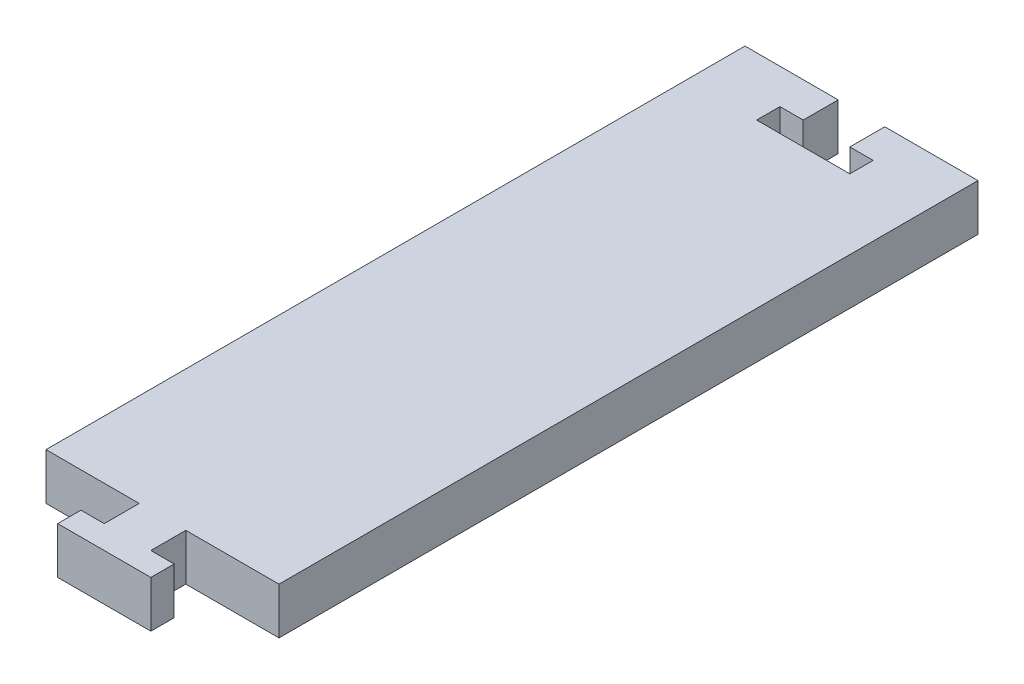
ISO-10303-21;
HEADER;
FILE_DESCRIPTION(('STEP AP214'),'2;1');
FILE_NAME('part.step','',(''),(''),'','','');
FILE_SCHEMA(('AUTOMOTIVE_DESIGN { 1 0 10303 214 1 1 1 1 }'));
ENDSEC;
DATA;
#1=APPLICATION_CONTEXT('core data for automotive mechanical design processes');
#2=APPLICATION_PROTOCOL_DEFINITION('international standard','automotive_design',2000,#1);
#3=PRODUCT_CONTEXT('',#1,'mechanical');
#4=PRODUCT('Part','Part','',(#3));
#5=PRODUCT_RELATED_PRODUCT_CATEGORY('part','',(#4));
#6=PRODUCT_DEFINITION_FORMATION('','',#4);
#7=PRODUCT_DEFINITION_CONTEXT('part definition',#1,'design');
#8=PRODUCT_DEFINITION('design','',#6,#7);
#9=PRODUCT_DEFINITION_SHAPE('','',#8);
#10=(LENGTH_UNIT() NAMED_UNIT(*) SI_UNIT(.MILLI.,.METRE.));
#11=(NAMED_UNIT(*) PLANE_ANGLE_UNIT() SI_UNIT($,.RADIAN.));
#12=(NAMED_UNIT(*) SI_UNIT($,.STERADIAN.) SOLID_ANGLE_UNIT());
#13=UNCERTAINTY_MEASURE_WITH_UNIT(LENGTH_MEASURE(1.E-05),#10,'distance_accuracy_value','');
#14=(GEOMETRIC_REPRESENTATION_CONTEXT(3) GLOBAL_UNCERTAINTY_ASSIGNED_CONTEXT((#13)) GLOBAL_UNIT_ASSIGNED_CONTEXT((#10,
#11,#12)) REPRESENTATION_CONTEXT('',''));
#15=CARTESIAN_POINT('',(0.,0.,0.));
#16=DIRECTION('',(0.,0.,1.));
#17=DIRECTION('',(1.,0.,0.));
#18=AXIS2_PLACEMENT_3D('',#15,#16,#17);
#19=CARTESIAN_POINT('',(10.,4.,17.5));
#20=DIRECTION('',(-1.,0.,0.));
#21=DIRECTION('',(0.,0.,1.));
#22=AXIS2_PLACEMENT_3D('',#19,#20,#21);
#23=PLANE('',#22);
#24=DIRECTION('',(0.,0.,-1.));
#25=VECTOR('',#24,1.);
#26=CARTESIAN_POINT('',(10.,0.,17.5));
#27=LINE('',#26,#25);
#28=CARTESIAN_POINT('',(10.,0.,17.5));
#29=VERTEX_POINT('',#28);
#30=CARTESIAN_POINT('',(9.99999999999999,0.,-42.5));
#31=VERTEX_POINT('',#30);
#32=EDGE_CURVE('E203',#29,#31,#27,.T.);
#33=ORIENTED_EDGE('',*,*,#32,.T.);
#34=DIRECTION('',(0.,-1.,0.));
#35=VECTOR('',#34,1.);
#36=CARTESIAN_POINT('',(9.99999999999999,4.,-42.5));
#37=LINE('',#36,#35);
#38=CARTESIAN_POINT('',(9.99999999999999,4.,-42.5));
#39=VERTEX_POINT('',#38);
#40=EDGE_CURVE('E11',#39,#31,#37,.T.);
#41=ORIENTED_EDGE('',*,*,#40,.F.);
#42=DIRECTION('',(0.,0.,-1.));
#43=VECTOR('',#42,1.);
#44=CARTESIAN_POINT('',(10.,4.,17.5));
#45=LINE('',#44,#43);
#46=CARTESIAN_POINT('',(10.,4.,17.5));
#47=VERTEX_POINT('',#46);
#48=EDGE_CURVE('E241',#47,#39,#45,.T.);
#49=ORIENTED_EDGE('',*,*,#48,.F.);
#50=DIRECTION('',(0.,-1.,0.));
#51=VECTOR('',#50,1.);
#52=CARTESIAN_POINT('',(10.,4.,17.5));
#53=LINE('',#52,#51);
#54=EDGE_CURVE('E199',#47,#29,#53,.T.);
#55=ORIENTED_EDGE('',*,*,#54,.T.);
#56=EDGE_LOOP('',(#33,#41,#49,#55));
#57=FACE_BOUND('',#56,.T.);
#58=ADVANCED_FACE('F35',(#57),#23,.F.);
#59=CARTESIAN_POINT('',(9.99999999999999,4.,-42.5));
#60=DIRECTION('',(0.,0.,1.));
#61=DIRECTION('',(1.,0.,0.));
#62=AXIS2_PLACEMENT_3D('',#59,#60,#61);
#63=PLANE('',#62);
#64=DIRECTION('',(-1.,0.,0.));
#65=VECTOR('',#64,1.);
#66=CARTESIAN_POINT('',(9.99999999999999,0.,-42.5));
#67=LINE('',#66,#65);
#68=CARTESIAN_POINT('',(2.,0.,-42.5));
#69=VERTEX_POINT('',#68);
#70=EDGE_CURVE('E206',#31,#69,#67,.T.);
#71=ORIENTED_EDGE('',*,*,#70,.T.);
#72=DIRECTION('',(0.,-1.,0.));
#73=VECTOR('',#72,1.);
#74=CARTESIAN_POINT('',(2.,4.,-42.5));
#75=LINE('',#74,#73);
#76=CARTESIAN_POINT('',(2.,4.,-42.5));
#77=VERTEX_POINT('',#76);
#78=EDGE_CURVE('E43',#77,#69,#75,.T.);
#79=ORIENTED_EDGE('',*,*,#78,.F.);
#80=DIRECTION('',(-1.,0.,0.));
#81=VECTOR('',#80,1.);
#82=CARTESIAN_POINT('',(9.99999999999999,4.,-42.5));
#83=LINE('',#82,#81);
#84=EDGE_CURVE('E130',#39,#77,#83,.T.);
#85=ORIENTED_EDGE('',*,*,#84,.F.);
#86=ORIENTED_EDGE('',*,*,#40,.T.);
#87=EDGE_LOOP('',(#71,#79,#85,#86));
#88=FACE_BOUND('',#87,.T.);
#89=ADVANCED_FACE('F359',(#88),#63,.F.);
#90=CARTESIAN_POINT('',(2.,4.,-39.5));
#91=DIRECTION('',(1.,0.,0.));
#92=DIRECTION('',(0.,0.,-1.));
#93=AXIS2_PLACEMENT_3D('',#90,#91,#92);
#94=PLANE('',#93);
#95=DIRECTION('',(0.,0.,1.));
#96=VECTOR('',#95,1.);
#97=CARTESIAN_POINT('',(2.,0.,-39.5));
#98=LINE('',#97,#96);
#99=CARTESIAN_POINT('',(2.,0.,-39.5));
#100=VERTEX_POINT('',#99);
#101=EDGE_CURVE('E208',#69,#100,#98,.T.);
#102=ORIENTED_EDGE('',*,*,#101,.T.);
#103=DIRECTION('',(0.,-1.,0.));
#104=VECTOR('',#103,1.);
#105=CARTESIAN_POINT('',(2.,4.,-39.5));
#106=LINE('',#105,#104);
#107=CARTESIAN_POINT('',(2.,4.,-39.5));
#108=VERTEX_POINT('',#107);
#109=EDGE_CURVE('E284',#108,#100,#106,.T.);
#110=ORIENTED_EDGE('',*,*,#109,.F.);
#111=DIRECTION('',(0.,0.,1.));
#112=VECTOR('',#111,1.);
#113=CARTESIAN_POINT('',(2.,4.,-39.5));
#114=LINE('',#113,#112);
#115=EDGE_CURVE('E292',#77,#108,#114,.T.);
#116=ORIENTED_EDGE('',*,*,#115,.F.);
#117=ORIENTED_EDGE('',*,*,#78,.T.);
#118=EDGE_LOOP('',(#102,#110,#116,#117));
#119=FACE_BOUND('',#118,.T.);
#120=ADVANCED_FACE('F290',(#119),#94,.F.);
#121=CARTESIAN_POINT('',(4.,4.,-39.5));
#122=DIRECTION('',(0.,0.,-1.));
#123=DIRECTION('',(-1.,0.,0.));
#124=AXIS2_PLACEMENT_3D('',#121,#122,#123);
#125=PLANE('',#124);
#126=DIRECTION('',(1.,0.,0.));
#127=VECTOR('',#126,1.);
#128=CARTESIAN_POINT('',(4.,0.,-39.5));
#129=LINE('',#128,#127);
#130=CARTESIAN_POINT('',(4.,0.,-39.5));
#131=VERTEX_POINT('',#130);
#132=EDGE_CURVE('E210',#100,#131,#129,.T.);
#133=ORIENTED_EDGE('',*,*,#132,.T.);
#134=DIRECTION('',(0.,-1.,0.));
#135=VECTOR('',#134,1.);
#136=CARTESIAN_POINT('',(4.,4.,-39.5));
#137=LINE('',#136,#135);
#138=CARTESIAN_POINT('',(4.,4.,-39.5));
#139=VERTEX_POINT('',#138);
#140=EDGE_CURVE('E281',#139,#131,#137,.T.);
#141=ORIENTED_EDGE('',*,*,#140,.F.);
#142=DIRECTION('',(1.,0.,0.));
#143=VECTOR('',#142,1.);
#144=CARTESIAN_POINT('',(4.,4.,-39.5));
#145=LINE('',#144,#143);
#146=EDGE_CURVE('E310',#108,#139,#145,.T.);
#147=ORIENTED_EDGE('',*,*,#146,.F.);
#148=ORIENTED_EDGE('',*,*,#109,.T.);
#149=EDGE_LOOP('',(#133,#141,#147,#148));
#150=FACE_BOUND('',#149,.T.);
#151=ADVANCED_FACE('F301',(#150),#125,.F.);
#152=CARTESIAN_POINT('',(4.,4.,-37.5));
#153=DIRECTION('',(1.,0.,0.));
#154=DIRECTION('',(0.,0.,-1.));
#155=AXIS2_PLACEMENT_3D('',#152,#153,#154);
#156=PLANE('',#155);
#157=DIRECTION('',(0.,0.,1.));
#158=VECTOR('',#157,1.);
#159=CARTESIAN_POINT('',(4.,0.,-37.5));
#160=LINE('',#159,#158);
#161=CARTESIAN_POINT('',(4.,0.,-37.5));
#162=VERTEX_POINT('',#161);
#163=EDGE_CURVE('E212',#131,#162,#160,.T.);
#164=ORIENTED_EDGE('',*,*,#163,.T.);
#165=DIRECTION('',(0.,-1.,0.));
#166=VECTOR('',#165,1.);
#167=CARTESIAN_POINT('',(4.,4.,-37.5));
#168=LINE('',#167,#166);
#169=CARTESIAN_POINT('',(4.,4.,-37.5));
#170=VERTEX_POINT('',#169);
#171=EDGE_CURVE('E278',#170,#162,#168,.T.);
#172=ORIENTED_EDGE('',*,*,#171,.F.);
#173=DIRECTION('',(0.,0.,1.));
#174=VECTOR('',#173,1.);
#175=CARTESIAN_POINT('',(4.,4.,-37.5));
#176=LINE('',#175,#174);
#177=EDGE_CURVE('E307',#139,#170,#176,.T.);
#178=ORIENTED_EDGE('',*,*,#177,.F.);
#179=ORIENTED_EDGE('',*,*,#140,.T.);
#180=EDGE_LOOP('',(#164,#172,#178,#179));
#181=FACE_BOUND('',#180,.T.);
#182=ADVANCED_FACE('F305',(#181),#156,.F.);
#183=CARTESIAN_POINT('',(-4.,4.,-37.5));
#184=DIRECTION('',(0.,0.,1.));
#185=DIRECTION('',(1.,0.,0.));
#186=AXIS2_PLACEMENT_3D('',#183,#184,#185);
#187=PLANE('',#186);
#188=DIRECTION('',(-1.,0.,0.));
#189=VECTOR('',#188,1.);
#190=CARTESIAN_POINT('',(-4.,0.,-37.5));
#191=LINE('',#190,#189);
#192=CARTESIAN_POINT('',(-4.,0.,-37.5));
#193=VERTEX_POINT('',#192);
#194=EDGE_CURVE('E214',#162,#193,#191,.T.);
#195=ORIENTED_EDGE('',*,*,#194,.T.);
#196=DIRECTION('',(0.,-1.,0.));
#197=VECTOR('',#196,1.);
#198=CARTESIAN_POINT('',(-4.,4.,-37.5));
#199=LINE('',#198,#197);
#200=CARTESIAN_POINT('',(-4.,4.,-37.5));
#201=VERTEX_POINT('',#200);
#202=EDGE_CURVE('E275',#201,#193,#199,.T.);
#203=ORIENTED_EDGE('',*,*,#202,.F.);
#204=DIRECTION('',(-1.,0.,0.));
#205=VECTOR('',#204,1.);
#206=CARTESIAN_POINT('',(-4.,4.,-37.5));
#207=LINE('',#206,#205);
#208=EDGE_CURVE('E309',#170,#201,#207,.T.);
#209=ORIENTED_EDGE('',*,*,#208,.F.);
#210=ORIENTED_EDGE('',*,*,#171,.T.);
#211=EDGE_LOOP('',(#195,#203,#209,#210));
#212=FACE_BOUND('',#211,.T.);
#213=ADVANCED_FACE('F372',(#212),#187,.F.);
#214=CARTESIAN_POINT('',(-4.,4.,-37.5));
#215=DIRECTION('',(-1.,0.,0.));
#216=DIRECTION('',(0.,0.,1.));
#217=AXIS2_PLACEMENT_3D('',#214,#215,#216);
#218=PLANE('',#217);
#219=DIRECTION('',(0.,0.,-1.));
#220=VECTOR('',#219,1.);
#221=CARTESIAN_POINT('',(-4.,0.,-37.5));
#222=LINE('',#221,#220);
#223=CARTESIAN_POINT('',(-4.,0.,-39.5));
#224=VERTEX_POINT('',#223);
#225=EDGE_CURVE('E216',#193,#224,#222,.T.);
#226=ORIENTED_EDGE('',*,*,#225,.T.);
#227=DIRECTION('',(0.,-1.,0.));
#228=VECTOR('',#227,1.);
#229=CARTESIAN_POINT('',(-4.,4.,-39.5));
#230=LINE('',#229,#228);
#231=CARTESIAN_POINT('',(-4.,4.,-39.5));
#232=VERTEX_POINT('',#231);
#233=EDGE_CURVE('E272',#232,#224,#230,.T.);
#234=ORIENTED_EDGE('',*,*,#233,.F.);
#235=DIRECTION('',(0.,0.,-1.));
#236=VECTOR('',#235,1.);
#237=CARTESIAN_POINT('',(-4.,4.,-37.5));
#238=LINE('',#237,#236);
#239=EDGE_CURVE('E312',#201,#232,#238,.T.);
#240=ORIENTED_EDGE('',*,*,#239,.F.);
#241=ORIENTED_EDGE('',*,*,#202,.T.);
#242=EDGE_LOOP('',(#226,#234,#240,#241));
#243=FACE_BOUND('',#242,.T.);
#244=ADVANCED_FACE('F375',(#243),#218,.F.);
#245=CARTESIAN_POINT('',(-4.,4.,-39.5));
#246=DIRECTION('',(0.,0.,-1.));
#247=DIRECTION('',(-1.,0.,0.));
#248=AXIS2_PLACEMENT_3D('',#245,#246,#247);
#249=PLANE('',#248);
#250=DIRECTION('',(1.,0.,0.));
#251=VECTOR('',#250,1.);
#252=CARTESIAN_POINT('',(-4.,0.,-39.5));
#253=LINE('',#252,#251);
#254=CARTESIAN_POINT('',(-2.,0.,-39.5));
#255=VERTEX_POINT('',#254);
#256=EDGE_CURVE('E218',#224,#255,#253,.T.);
#257=ORIENTED_EDGE('',*,*,#256,.T.);
#258=DIRECTION('',(0.,-1.,0.));
#259=VECTOR('',#258,1.);
#260=CARTESIAN_POINT('',(-2.,4.,-39.5));
#261=LINE('',#260,#259);
#262=CARTESIAN_POINT('',(-2.,4.,-39.5));
#263=VERTEX_POINT('',#262);
#264=EDGE_CURVE('E269',#263,#255,#261,.T.);
#265=ORIENTED_EDGE('',*,*,#264,.F.);
#266=DIRECTION('',(1.,0.,0.));
#267=VECTOR('',#266,1.);
#268=CARTESIAN_POINT('',(-4.,4.,-39.5));
#269=LINE('',#268,#267);
#270=EDGE_CURVE('E318',#232,#263,#269,.T.);
#271=ORIENTED_EDGE('',*,*,#270,.F.);
#272=ORIENTED_EDGE('',*,*,#233,.T.);
#273=EDGE_LOOP('',(#257,#265,#271,#272));
#274=FACE_BOUND('',#273,.T.);
#275=ADVANCED_FACE('F379',(#274),#249,.F.);
#276=CARTESIAN_POINT('',(-2.,4.,-39.5));
#277=DIRECTION('',(-1.,0.,0.));
#278=DIRECTION('',(0.,0.,1.));
#279=AXIS2_PLACEMENT_3D('',#276,#277,#278);
#280=PLANE('',#279);
#281=DIRECTION('',(0.,0.,-1.));
#282=VECTOR('',#281,1.);
#283=CARTESIAN_POINT('',(-2.,0.,-39.5));
#284=LINE('',#283,#282);
#285=CARTESIAN_POINT('',(-2.,0.,-42.5));
#286=VERTEX_POINT('',#285);
#287=EDGE_CURVE('E220',#255,#286,#284,.T.);
#288=ORIENTED_EDGE('',*,*,#287,.T.);
#289=DIRECTION('',(0.,-1.,0.));
#290=VECTOR('',#289,1.);
#291=CARTESIAN_POINT('',(-2.,4.,-42.5));
#292=LINE('',#291,#290);
#293=CARTESIAN_POINT('',(-2.,4.,-42.5));
#294=VERTEX_POINT('',#293);
#295=EDGE_CURVE('E266',#294,#286,#292,.T.);
#296=ORIENTED_EDGE('',*,*,#295,.F.);
#297=DIRECTION('',(0.,0.,-1.));
#298=VECTOR('',#297,1.);
#299=CARTESIAN_POINT('',(-2.,4.,-39.5));
#300=LINE('',#299,#298);
#301=EDGE_CURVE('E320',#263,#294,#300,.T.);
#302=ORIENTED_EDGE('',*,*,#301,.F.);
#303=ORIENTED_EDGE('',*,*,#264,.T.);
#304=EDGE_LOOP('',(#288,#296,#302,#303));
#305=FACE_BOUND('',#304,.T.);
#306=ADVANCED_FACE('F383',(#305),#280,.F.);
#307=CARTESIAN_POINT('',(-2.,4.,-42.5));
#308=DIRECTION('',(0.,0.,1.));
#309=DIRECTION('',(1.,0.,0.));
#310=AXIS2_PLACEMENT_3D('',#307,#308,#309);
#311=PLANE('',#310);
#312=DIRECTION('',(-1.,0.,0.));
#313=VECTOR('',#312,1.);
#314=CARTESIAN_POINT('',(-2.,0.,-42.5));
#315=LINE('',#314,#313);
#316=CARTESIAN_POINT('',(-10.,0.,-42.5));
#317=VERTEX_POINT('',#316);
#318=EDGE_CURVE('E222',#286,#317,#315,.T.);
#319=ORIENTED_EDGE('',*,*,#318,.T.);
#320=DIRECTION('',(0.,-1.,0.));
#321=VECTOR('',#320,1.);
#322=CARTESIAN_POINT('',(-10.,4.,-42.5));
#323=LINE('',#322,#321);
#324=CARTESIAN_POINT('',(-10.,4.,-42.5));
#325=VERTEX_POINT('',#324);
#326=EDGE_CURVE('E263',#325,#317,#323,.T.);
#327=ORIENTED_EDGE('',*,*,#326,.F.);
#328=DIRECTION('',(-1.,0.,0.));
#329=VECTOR('',#328,1.);
#330=CARTESIAN_POINT('',(-2.,4.,-42.5));
#331=LINE('',#330,#329);
#332=EDGE_CURVE('E322',#294,#325,#331,.T.);
#333=ORIENTED_EDGE('',*,*,#332,.F.);
#334=ORIENTED_EDGE('',*,*,#295,.T.);
#335=EDGE_LOOP('',(#319,#327,#333,#334));
#336=FACE_BOUND('',#335,.T.);
#337=ADVANCED_FACE('F387',(#336),#311,.F.);
#338=CARTESIAN_POINT('',(-10.,4.,17.5));
#339=DIRECTION('',(1.,0.,0.));
#340=DIRECTION('',(0.,0.,-1.));
#341=AXIS2_PLACEMENT_3D('',#338,#339,#340);
#342=PLANE('',#341);
#343=DIRECTION('',(0.,0.,1.));
#344=VECTOR('',#343,1.);
#345=CARTESIAN_POINT('',(-10.,0.,17.5));
#346=LINE('',#345,#344);
#347=CARTESIAN_POINT('',(-10.,0.,17.5));
#348=VERTEX_POINT('',#347);
#349=EDGE_CURVE('E224',#317,#348,#346,.T.);
#350=ORIENTED_EDGE('',*,*,#349,.T.);
#351=DIRECTION('',(0.,-1.,0.));
#352=VECTOR('',#351,1.);
#353=CARTESIAN_POINT('',(-10.,4.,17.5));
#354=LINE('',#353,#352);
#355=CARTESIAN_POINT('',(-10.,4.,17.5));
#356=VERTEX_POINT('',#355);
#357=EDGE_CURVE('E260',#356,#348,#354,.T.);
#358=ORIENTED_EDGE('',*,*,#357,.F.);
#359=DIRECTION('',(0.,0.,1.));
#360=VECTOR('',#359,1.);
#361=CARTESIAN_POINT('',(-10.,4.,17.5));
#362=LINE('',#361,#360);
#363=EDGE_CURVE('E324',#325,#356,#362,.T.);
#364=ORIENTED_EDGE('',*,*,#363,.F.);
#365=ORIENTED_EDGE('',*,*,#326,.T.);
#366=EDGE_LOOP('',(#350,#358,#364,#365));
#367=FACE_BOUND('',#366,.T.);
#368=ADVANCED_FACE('F391',(#367),#342,.F.);
#369=CARTESIAN_POINT('',(-2.,4.,17.5));
#370=DIRECTION('',(0.,0.,-1.));
#371=DIRECTION('',(-1.,0.,0.));
#372=AXIS2_PLACEMENT_3D('',#369,#370,#371);
#373=PLANE('',#372);
#374=DIRECTION('',(1.,0.,0.));
#375=VECTOR('',#374,1.);
#376=CARTESIAN_POINT('',(-2.,0.,17.5));
#377=LINE('',#376,#375);
#378=CARTESIAN_POINT('',(-2.,0.,17.5));
#379=VERTEX_POINT('',#378);
#380=EDGE_CURVE('E226',#348,#379,#377,.T.);
#381=ORIENTED_EDGE('',*,*,#380,.T.);
#382=DIRECTION('',(0.,-1.,0.));
#383=VECTOR('',#382,1.);
#384=CARTESIAN_POINT('',(-2.,4.,17.5));
#385=LINE('',#384,#383);
#386=CARTESIAN_POINT('',(-2.,4.,17.5));
#387=VERTEX_POINT('',#386);
#388=EDGE_CURVE('E257',#387,#379,#385,.T.);
#389=ORIENTED_EDGE('',*,*,#388,.F.);
#390=DIRECTION('',(1.,0.,0.));
#391=VECTOR('',#390,1.);
#392=CARTESIAN_POINT('',(-2.,4.,17.5));
#393=LINE('',#392,#391);
#394=EDGE_CURVE('E326',#356,#387,#393,.T.);
#395=ORIENTED_EDGE('',*,*,#394,.F.);
#396=ORIENTED_EDGE('',*,*,#357,.T.);
#397=EDGE_LOOP('',(#381,#389,#395,#396));
#398=FACE_BOUND('',#397,.T.);
#399=ADVANCED_FACE('F395',(#398),#373,.F.);
#400=CARTESIAN_POINT('',(-2.,4.,20.5));
#401=DIRECTION('',(1.,0.,0.));
#402=DIRECTION('',(0.,0.,-1.));
#403=AXIS2_PLACEMENT_3D('',#400,#401,#402);
#404=PLANE('',#403);
#405=DIRECTION('',(0.,0.,1.));
#406=VECTOR('',#405,1.);
#407=CARTESIAN_POINT('',(-2.,0.,20.5));
#408=LINE('',#407,#406);
#409=CARTESIAN_POINT('',(-2.,0.,20.5));
#410=VERTEX_POINT('',#409);
#411=EDGE_CURVE('E228',#379,#410,#408,.T.);
#412=ORIENTED_EDGE('',*,*,#411,.T.);
#413=DIRECTION('',(0.,-1.,0.));
#414=VECTOR('',#413,1.);
#415=CARTESIAN_POINT('',(-2.,4.,20.5));
#416=LINE('',#415,#414);
#417=CARTESIAN_POINT('',(-2.,4.,20.5));
#418=VERTEX_POINT('',#417);
#419=EDGE_CURVE('E254',#418,#410,#416,.T.);
#420=ORIENTED_EDGE('',*,*,#419,.F.);
#421=DIRECTION('',(0.,0.,1.));
#422=VECTOR('',#421,1.);
#423=CARTESIAN_POINT('',(-2.,4.,20.5));
#424=LINE('',#423,#422);
#425=EDGE_CURVE('E328',#387,#418,#424,.T.);
#426=ORIENTED_EDGE('',*,*,#425,.F.);
#427=ORIENTED_EDGE('',*,*,#388,.T.);
#428=EDGE_LOOP('',(#412,#420,#426,#427));
#429=FACE_BOUND('',#428,.T.);
#430=ADVANCED_FACE('F399',(#429),#404,.F.);
#431=CARTESIAN_POINT('',(-4.,4.,20.5));
#432=DIRECTION('',(0.,0.,1.));
#433=DIRECTION('',(1.,0.,0.));
#434=AXIS2_PLACEMENT_3D('',#431,#432,#433);
#435=PLANE('',#434);
#436=DIRECTION('',(-1.,0.,0.));
#437=VECTOR('',#436,1.);
#438=CARTESIAN_POINT('',(-4.,0.,20.5));
#439=LINE('',#438,#437);
#440=CARTESIAN_POINT('',(-4.,0.,20.5));
#441=VERTEX_POINT('',#440);
#442=EDGE_CURVE('E230',#410,#441,#439,.T.);
#443=ORIENTED_EDGE('',*,*,#442,.T.);
#444=DIRECTION('',(0.,-1.,0.));
#445=VECTOR('',#444,1.);
#446=CARTESIAN_POINT('',(-4.,4.,20.5));
#447=LINE('',#446,#445);
#448=CARTESIAN_POINT('',(-4.,4.,20.5));
#449=VERTEX_POINT('',#448);
#450=EDGE_CURVE('E251',#449,#441,#447,.T.);
#451=ORIENTED_EDGE('',*,*,#450,.F.);
#452=DIRECTION('',(-1.,0.,0.));
#453=VECTOR('',#452,1.);
#454=CARTESIAN_POINT('',(-4.,4.,20.5));
#455=LINE('',#454,#453);
#456=EDGE_CURVE('E330',#418,#449,#455,.T.);
#457=ORIENTED_EDGE('',*,*,#456,.F.);
#458=ORIENTED_EDGE('',*,*,#419,.T.);
#459=EDGE_LOOP('',(#443,#451,#457,#458));
#460=FACE_BOUND('',#459,.T.);
#461=ADVANCED_FACE('F403',(#460),#435,.F.);
#462=CARTESIAN_POINT('',(-4.,4.,22.5));
#463=DIRECTION('',(1.,0.,0.));
#464=DIRECTION('',(0.,0.,-1.));
#465=AXIS2_PLACEMENT_3D('',#462,#463,#464);
#466=PLANE('',#465);
#467=DIRECTION('',(0.,0.,1.));
#468=VECTOR('',#467,1.);
#469=CARTESIAN_POINT('',(-4.,0.,22.5));
#470=LINE('',#469,#468);
#471=CARTESIAN_POINT('',(-4.,0.,22.5));
#472=VERTEX_POINT('',#471);
#473=EDGE_CURVE('E232',#441,#472,#470,.T.);
#474=ORIENTED_EDGE('',*,*,#473,.T.);
#475=DIRECTION('',(0.,-1.,0.));
#476=VECTOR('',#475,1.);
#477=CARTESIAN_POINT('',(-4.,4.,22.5));
#478=LINE('',#477,#476);
#479=CARTESIAN_POINT('',(-4.,4.,22.5));
#480=VERTEX_POINT('',#479);
#481=EDGE_CURVE('E248',#480,#472,#478,.T.);
#482=ORIENTED_EDGE('',*,*,#481,.F.);
#483=DIRECTION('',(0.,0.,1.));
#484=VECTOR('',#483,1.);
#485=CARTESIAN_POINT('',(-4.,4.,22.5));
#486=LINE('',#485,#484);
#487=EDGE_CURVE('E332',#449,#480,#486,.T.);
#488=ORIENTED_EDGE('',*,*,#487,.F.);
#489=ORIENTED_EDGE('',*,*,#450,.T.);
#490=EDGE_LOOP('',(#474,#482,#488,#489));
#491=FACE_BOUND('',#490,.T.);
#492=ADVANCED_FACE('F407',(#491),#466,.F.);
#493=CARTESIAN_POINT('',(-4.,4.,22.5));
#494=DIRECTION('',(0.,0.,-1.));
#495=DIRECTION('',(-1.,0.,0.));
#496=AXIS2_PLACEMENT_3D('',#493,#494,#495);
#497=PLANE('',#496);
#498=DIRECTION('',(1.,0.,0.));
#499=VECTOR('',#498,1.);
#500=CARTESIAN_POINT('',(-4.,0.,22.5));
#501=LINE('',#500,#499);
#502=CARTESIAN_POINT('',(4.,0.,22.5));
#503=VERTEX_POINT('',#502);
#504=EDGE_CURVE('E234',#472,#503,#501,.T.);
#505=ORIENTED_EDGE('',*,*,#504,.T.);
#506=DIRECTION('',(0.,-1.,0.));
#507=VECTOR('',#506,1.);
#508=CARTESIAN_POINT('',(4.,4.,22.5));
#509=LINE('',#508,#507);
#510=CARTESIAN_POINT('',(4.,4.,22.5));
#511=VERTEX_POINT('',#510);
#512=EDGE_CURVE('E245',#511,#503,#509,.T.);
#513=ORIENTED_EDGE('',*,*,#512,.F.);
#514=DIRECTION('',(1.,0.,0.));
#515=VECTOR('',#514,1.);
#516=CARTESIAN_POINT('',(-4.,4.,22.5));
#517=LINE('',#516,#515);
#518=EDGE_CURVE('E334',#480,#511,#517,.T.);
#519=ORIENTED_EDGE('',*,*,#518,.F.);
#520=ORIENTED_EDGE('',*,*,#481,.T.);
#521=EDGE_LOOP('',(#505,#513,#519,#520));
#522=FACE_BOUND('',#521,.T.);
#523=ADVANCED_FACE('F340',(#522),#497,.F.);
#524=CARTESIAN_POINT('',(4.,4.,22.5));
#525=DIRECTION('',(-1.,0.,0.));
#526=DIRECTION('',(0.,0.,1.));
#527=AXIS2_PLACEMENT_3D('',#524,#525,#526);
#528=PLANE('',#527);
#529=DIRECTION('',(0.,0.,-1.));
#530=VECTOR('',#529,1.);
#531=CARTESIAN_POINT('',(4.,0.,22.5));
#532=LINE('',#531,#530);
#533=CARTESIAN_POINT('',(4.,0.,20.5));
#534=VERTEX_POINT('',#533);
#535=EDGE_CURVE('E236',#503,#534,#532,.T.);
#536=ORIENTED_EDGE('',*,*,#535,.T.);
#537=DIRECTION('',(0.,-1.,0.));
#538=VECTOR('',#537,1.);
#539=CARTESIAN_POINT('',(4.,4.,20.5));
#540=LINE('',#539,#538);
#541=CARTESIAN_POINT('',(4.,4.,20.5));
#542=VERTEX_POINT('',#541);
#543=EDGE_CURVE('E194',#542,#534,#540,.T.);
#544=ORIENTED_EDGE('',*,*,#543,.F.);
#545=DIRECTION('',(0.,0.,-1.));
#546=VECTOR('',#545,1.);
#547=CARTESIAN_POINT('',(4.,4.,22.5));
#548=LINE('',#547,#546);
#549=EDGE_CURVE('E185',#511,#542,#548,.T.);
#550=ORIENTED_EDGE('',*,*,#549,.F.);
#551=ORIENTED_EDGE('',*,*,#512,.T.);
#552=EDGE_LOOP('',(#536,#544,#550,#551));
#553=FACE_BOUND('',#552,.T.);
#554=ADVANCED_FACE('F344',(#553),#528,.F.);
#555=CARTESIAN_POINT('',(4.,4.,20.5));
#556=DIRECTION('',(0.,0.,1.));
#557=DIRECTION('',(1.,0.,0.));
#558=AXIS2_PLACEMENT_3D('',#555,#556,#557);
#559=PLANE('',#558);
#560=DIRECTION('',(-1.,0.,0.));
#561=VECTOR('',#560,1.);
#562=CARTESIAN_POINT('',(4.,0.,20.5));
#563=LINE('',#562,#561);
#564=CARTESIAN_POINT('',(2.,0.,20.5));
#565=VERTEX_POINT('',#564);
#566=EDGE_CURVE('E193',#534,#565,#563,.T.);
#567=ORIENTED_EDGE('',*,*,#566,.T.);
#568=DIRECTION('',(0.,-1.,0.));
#569=VECTOR('',#568,1.);
#570=CARTESIAN_POINT('',(2.,4.,20.5));
#571=LINE('',#570,#569);
#572=CARTESIAN_POINT('',(2.,4.,20.5));
#573=VERTEX_POINT('',#572);
#574=EDGE_CURVE('E190',#573,#565,#571,.T.);
#575=ORIENTED_EDGE('',*,*,#574,.F.);
#576=DIRECTION('',(-1.,0.,0.));
#577=VECTOR('',#576,1.);
#578=CARTESIAN_POINT('',(4.,4.,20.5));
#579=LINE('',#578,#577);
#580=EDGE_CURVE('E179',#542,#573,#579,.T.);
#581=ORIENTED_EDGE('',*,*,#580,.F.);
#582=ORIENTED_EDGE('',*,*,#543,.T.);
#583=EDGE_LOOP('',(#567,#575,#581,#582));
#584=FACE_BOUND('',#583,.T.);
#585=ADVANCED_FACE('F191',(#584),#559,.F.);
#586=CARTESIAN_POINT('',(2.,4.,20.5));
#587=DIRECTION('',(-1.,0.,0.));
#588=DIRECTION('',(0.,0.,1.));
#589=AXIS2_PLACEMENT_3D('',#586,#587,#588);
#590=PLANE('',#589);
#591=DIRECTION('',(0.,0.,-1.));
#592=VECTOR('',#591,1.);
#593=CARTESIAN_POINT('',(2.,0.,20.5));
#594=LINE('',#593,#592);
#595=CARTESIAN_POINT('',(2.,0.,17.5));
#596=VERTEX_POINT('',#595);
#597=EDGE_CURVE('E116',#565,#596,#594,.T.);
#598=ORIENTED_EDGE('',*,*,#597,.T.);
#599=DIRECTION('',(0.,-1.,0.));
#600=VECTOR('',#599,1.);
#601=CARTESIAN_POINT('',(2.,4.,17.5));
#602=LINE('',#601,#600);
#603=CARTESIAN_POINT('',(2.,4.,17.5));
#604=VERTEX_POINT('',#603);
#605=EDGE_CURVE('E195',#604,#596,#602,.T.);
#606=ORIENTED_EDGE('',*,*,#605,.F.);
#607=DIRECTION('',(0.,0.,-1.));
#608=VECTOR('',#607,1.);
#609=CARTESIAN_POINT('',(2.,4.,20.5));
#610=LINE('',#609,#608);
#611=EDGE_CURVE('E183',#573,#604,#610,.T.);
#612=ORIENTED_EDGE('',*,*,#611,.F.);
#613=ORIENTED_EDGE('',*,*,#574,.T.);
#614=EDGE_LOOP('',(#598,#606,#612,#613));
#615=FACE_BOUND('',#614,.T.);
#616=ADVANCED_FACE('F197',(#615),#590,.F.);
#617=CARTESIAN_POINT('',(10.,4.,17.5));
#618=DIRECTION('',(0.,0.,-1.));
#619=DIRECTION('',(-1.,0.,0.));
#620=AXIS2_PLACEMENT_3D('',#617,#618,#619);
#621=PLANE('',#620);
#622=DIRECTION('',(1.,0.,0.));
#623=VECTOR('',#622,1.);
#624=CARTESIAN_POINT('',(10.,0.,17.5));
#625=LINE('',#624,#623);
#626=EDGE_CURVE('E122',#596,#29,#625,.T.);
#627=ORIENTED_EDGE('',*,*,#626,.T.);
#628=ORIENTED_EDGE('',*,*,#54,.F.);
#629=DIRECTION('',(1.,0.,0.));
#630=VECTOR('',#629,1.);
#631=CARTESIAN_POINT('',(10.,4.,17.5));
#632=LINE('',#631,#630);
#633=EDGE_CURVE('E51',#604,#47,#632,.T.);
#634=ORIENTED_EDGE('',*,*,#633,.F.);
#635=ORIENTED_EDGE('',*,*,#605,.T.);
#636=EDGE_LOOP('',(#627,#628,#634,#635));
#637=FACE_BOUND('',#636,.T.);
#638=ADVANCED_FACE('F348',(#637),#621,.F.);
#639=CARTESIAN_POINT('',(0.,4.,0.));
#640=DIRECTION('',(0.,1.,0.));
#641=DIRECTION('',(0.,0.,1.));
#642=AXIS2_PLACEMENT_3D('',#639,#640,#641);
#643=PLANE('',#642);
#644=ORIENTED_EDGE('',*,*,#48,.T.);
#645=ORIENTED_EDGE('',*,*,#84,.T.);
#646=ORIENTED_EDGE('',*,*,#115,.T.);
#647=ORIENTED_EDGE('',*,*,#146,.T.);
#648=ORIENTED_EDGE('',*,*,#177,.T.);
#649=ORIENTED_EDGE('',*,*,#208,.T.);
#650=ORIENTED_EDGE('',*,*,#239,.T.);
#651=ORIENTED_EDGE('',*,*,#270,.T.);
#652=ORIENTED_EDGE('',*,*,#301,.T.);
#653=ORIENTED_EDGE('',*,*,#332,.T.);
#654=ORIENTED_EDGE('',*,*,#363,.T.);
#655=ORIENTED_EDGE('',*,*,#394,.T.);
#656=ORIENTED_EDGE('',*,*,#425,.T.);
#657=ORIENTED_EDGE('',*,*,#456,.T.);
#658=ORIENTED_EDGE('',*,*,#487,.T.);
#659=ORIENTED_EDGE('',*,*,#518,.T.);
#660=ORIENTED_EDGE('',*,*,#549,.T.);
#661=ORIENTED_EDGE('',*,*,#580,.T.);
#662=ORIENTED_EDGE('',*,*,#611,.T.);
#663=ORIENTED_EDGE('',*,*,#633,.T.);
#664=EDGE_LOOP('',(#644,#645,#646,#647,#648,#649,#650,#651,#652,#653,#654,#655,#656,#657,#658,
#659,#660,#661,#662,#663));
#665=FACE_BOUND('',#664,.T.);
#666=ADVANCED_FACE('F181',(#665),#643,.T.);
#667=CARTESIAN_POINT('',(0.,0.,0.));
#668=DIRECTION('',(0.,1.,0.));
#669=DIRECTION('',(0.,0.,1.));
#670=AXIS2_PLACEMENT_3D('',#667,#668,#669);
#671=PLANE('',#670);
#672=ORIENTED_EDGE('',*,*,#32,.F.);
#673=ORIENTED_EDGE('',*,*,#626,.F.);
#674=ORIENTED_EDGE('',*,*,#597,.F.);
#675=ORIENTED_EDGE('',*,*,#566,.F.);
#676=ORIENTED_EDGE('',*,*,#535,.F.);
#677=ORIENTED_EDGE('',*,*,#504,.F.);
#678=ORIENTED_EDGE('',*,*,#473,.F.);
#679=ORIENTED_EDGE('',*,*,#442,.F.);
#680=ORIENTED_EDGE('',*,*,#411,.F.);
#681=ORIENTED_EDGE('',*,*,#380,.F.);
#682=ORIENTED_EDGE('',*,*,#349,.F.);
#683=ORIENTED_EDGE('',*,*,#318,.F.);
#684=ORIENTED_EDGE('',*,*,#287,.F.);
#685=ORIENTED_EDGE('',*,*,#256,.F.);
#686=ORIENTED_EDGE('',*,*,#225,.F.);
#687=ORIENTED_EDGE('',*,*,#194,.F.);
#688=ORIENTED_EDGE('',*,*,#163,.F.);
#689=ORIENTED_EDGE('',*,*,#132,.F.);
#690=ORIENTED_EDGE('',*,*,#101,.F.);
#691=ORIENTED_EDGE('',*,*,#70,.F.);
#692=EDGE_LOOP('',(#672,#673,#674,#675,#676,#677,#678,#679,#680,#681,#682,#683,#684,#685,#686,
#687,#688,#689,#690,#691));
#693=FACE_BOUND('',#692,.T.);
#694=ADVANCED_FACE('F296',(#693),#671,.F.);
#695=CLOSED_SHELL('',(#58,#89,#120,#151,#182,#213,#244,#275,#306,#337,#368,#399,#430,#461,#492,
#523,#554,#585,#616,#638,#666,#694));
#696=MANIFOLD_SOLID_BREP('B2',#695);
#697=ADVANCED_BREP_SHAPE_REPRESENTATION('',(#18,#696),#14);
#698=SHAPE_DEFINITION_REPRESENTATION(#9,#697);
ENDSEC;
END-ISO-10303-21;
